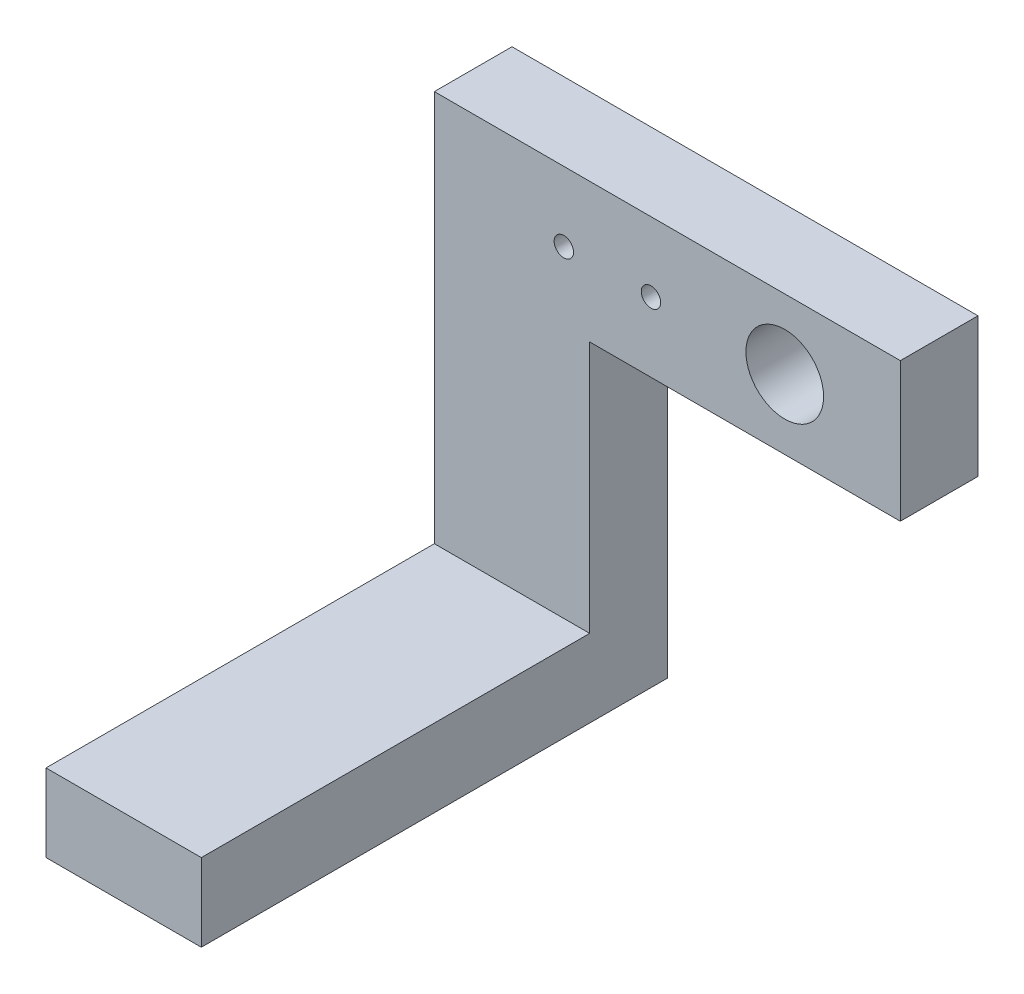
ISO-10303-21;
HEADER;
FILE_DESCRIPTION(('STEP AP214'),'2;1');
FILE_NAME('part.step','',(''),(''),'','','');
FILE_SCHEMA(('AUTOMOTIVE_DESIGN { 1 0 10303 214 1 1 1 1 }'));
ENDSEC;
DATA;
#1=APPLICATION_CONTEXT('core data for automotive mechanical design processes');
#2=APPLICATION_PROTOCOL_DEFINITION('international standard','automotive_design',2000,#1);
#3=PRODUCT_CONTEXT('',#1,'mechanical');
#4=PRODUCT('Part','Part','',(#3));
#5=PRODUCT_RELATED_PRODUCT_CATEGORY('part','',(#4));
#6=PRODUCT_DEFINITION_FORMATION('','',#4);
#7=PRODUCT_DEFINITION_CONTEXT('part definition',#1,'design');
#8=PRODUCT_DEFINITION('design','',#6,#7);
#9=PRODUCT_DEFINITION_SHAPE('','',#8);
#10=(LENGTH_UNIT() NAMED_UNIT(*) SI_UNIT(.MILLI.,.METRE.));
#11=(NAMED_UNIT(*) PLANE_ANGLE_UNIT() SI_UNIT($,.RADIAN.));
#12=(NAMED_UNIT(*) SI_UNIT($,.STERADIAN.) SOLID_ANGLE_UNIT());
#13=UNCERTAINTY_MEASURE_WITH_UNIT(LENGTH_MEASURE(1.E-05),#10,'distance_accuracy_value','');
#14=(GEOMETRIC_REPRESENTATION_CONTEXT(3) GLOBAL_UNCERTAINTY_ASSIGNED_CONTEXT((#13)) GLOBAL_UNIT_ASSIGNED_CONTEXT((#10,
#11,#12)) REPRESENTATION_CONTEXT('',''));
#15=CARTESIAN_POINT('',(0.,0.,0.));
#16=DIRECTION('',(0.,0.,1.));
#17=DIRECTION('',(1.,0.,0.));
#18=AXIS2_PLACEMENT_3D('',#15,#16,#17);
#19=CARTESIAN_POINT('',(7.56000000000001,-4.55,5.08));
#20=DIRECTION('',(-1.,0.,0.));
#21=DIRECTION('',(0.,-1.,0.));
#22=AXIS2_PLACEMENT_3D('',#19,#20,#21);
#23=PLANE('',#22);
#24=DIRECTION('',(0.,1.,0.));
#25=VECTOR('',#24,1.);
#26=CARTESIAN_POINT('',(7.56000000000001,-4.55,0.));
#27=LINE('',#26,#25);
#28=CARTESIAN_POINT('',(7.56000000000001,-4.55,0.));
#29=VERTEX_POINT('',#28);
#30=CARTESIAN_POINT('',(7.56000000000001,4.55,0.));
#31=VERTEX_POINT('',#30);
#32=EDGE_CURVE('E151',#29,#31,#27,.T.);
#33=ORIENTED_EDGE('',*,*,#32,.T.);
#34=DIRECTION('',(0.,0.,-1.));
#35=VECTOR('',#34,1.);
#36=CARTESIAN_POINT('',(7.56000000000001,4.55,5.08));
#37=LINE('',#36,#35);
#38=CARTESIAN_POINT('',(7.56000000000001,4.55,5.08));
#39=VERTEX_POINT('',#38);
#40=EDGE_CURVE('E11',#39,#31,#37,.T.);
#41=ORIENTED_EDGE('',*,*,#40,.F.);
#42=DIRECTION('',(0.,1.,0.));
#43=VECTOR('',#42,1.);
#44=CARTESIAN_POINT('',(7.56000000000001,-4.55,5.08));
#45=LINE('',#44,#43);
#46=CARTESIAN_POINT('',(7.56000000000001,-4.55,5.08));
#47=VERTEX_POINT('',#46);
#48=EDGE_CURVE('E152',#47,#39,#45,.T.);
#49=ORIENTED_EDGE('',*,*,#48,.F.);
#50=DIRECTION('',(0.,0.,-1.));
#51=VECTOR('',#50,1.);
#52=CARTESIAN_POINT('',(7.56000000000001,-4.55,5.08));
#53=LINE('',#52,#51);
#54=EDGE_CURVE('E160',#47,#29,#53,.T.);
#55=ORIENTED_EDGE('',*,*,#54,.T.);
#56=EDGE_LOOP('',(#33,#41,#49,#55));
#57=FACE_BOUND('',#56,.T.);
#58=ADVANCED_FACE('F40',(#57),#23,.F.);
#59=CARTESIAN_POINT('',(7.56000000000001,4.55,5.08));
#60=DIRECTION('',(0.,-1.,0.));
#61=DIRECTION('',(1.,0.,0.));
#62=AXIS2_PLACEMENT_3D('',#59,#60,#61);
#63=PLANE('',#62);
#64=DIRECTION('',(-1.,0.,0.));
#65=VECTOR('',#64,1.);
#66=CARTESIAN_POINT('',(7.56000000000001,4.55,0.));
#67=LINE('',#66,#65);
#68=CARTESIAN_POINT('',(-22.92,4.55,0.));
#69=VERTEX_POINT('',#68);
#70=EDGE_CURVE('E163',#31,#69,#67,.T.);
#71=ORIENTED_EDGE('',*,*,#70,.T.);
#72=DIRECTION('',(0.,0.,-1.));
#73=VECTOR('',#72,1.);
#74=CARTESIAN_POINT('',(-22.92,4.55,5.08));
#75=LINE('',#74,#73);
#76=CARTESIAN_POINT('',(-22.92,4.55,5.08));
#77=VERTEX_POINT('',#76);
#78=EDGE_CURVE('E47',#77,#69,#75,.T.);
#79=ORIENTED_EDGE('',*,*,#78,.F.);
#80=DIRECTION('',(-1.,0.,0.));
#81=VECTOR('',#80,1.);
#82=CARTESIAN_POINT('',(7.56000000000001,4.55,5.08));
#83=LINE('',#82,#81);
#84=EDGE_CURVE('E95',#39,#77,#83,.T.);
#85=ORIENTED_EDGE('',*,*,#84,.F.);
#86=ORIENTED_EDGE('',*,*,#40,.T.);
#87=EDGE_LOOP('',(#71,#79,#85,#86));
#88=FACE_BOUND('',#87,.T.);
#89=ADVANCED_FACE('F175',(#88),#63,.F.);
#90=CARTESIAN_POINT('',(-22.92,-4.55,5.08));
#91=DIRECTION('',(1.,0.,0.));
#92=DIRECTION('',(0.,1.,0.));
#93=AXIS2_PLACEMENT_3D('',#90,#91,#92);
#94=PLANE('',#93);
#95=DIRECTION('',(0.,-1.,0.));
#96=VECTOR('',#95,1.);
#97=CARTESIAN_POINT('',(-22.92,-4.55,0.));
#98=LINE('',#97,#96);
#99=CARTESIAN_POINT('',(-22.92,-26.14,0.));
#100=VERTEX_POINT('',#99);
#101=EDGE_CURVE('E120',#69,#100,#98,.T.);
#102=ORIENTED_EDGE('',*,*,#101,.T.);
#103=DIRECTION('',(0.,0.,-1.));
#104=VECTOR('',#103,1.);
#105=CARTESIAN_POINT('',(-22.92,-26.14,5.08));
#106=LINE('',#105,#104);
#107=CARTESIAN_POINT('',(-22.92,-26.14,30.48));
#108=VERTEX_POINT('',#107);
#109=EDGE_CURVE('E113',#108,#100,#106,.T.);
#110=ORIENTED_EDGE('',*,*,#109,.F.);
#111=DIRECTION('',(0.,-1.,0.));
#112=VECTOR('',#111,1.);
#113=CARTESIAN_POINT('',(-22.92,-26.14,30.48));
#114=LINE('',#113,#112);
#115=CARTESIAN_POINT('',(-22.92,-21.06,30.48));
#116=VERTEX_POINT('',#115);
#117=EDGE_CURVE('E118',#116,#108,#114,.T.);
#118=ORIENTED_EDGE('',*,*,#117,.F.);
#119=DIRECTION('',(0.,0.,-1.));
#120=VECTOR('',#119,1.);
#121=CARTESIAN_POINT('',(-22.92,-21.06,30.48));
#122=LINE('',#121,#120);
#123=CARTESIAN_POINT('',(-22.92,-21.06,5.08));
#124=VERTEX_POINT('',#123);
#125=EDGE_CURVE('E145',#116,#124,#122,.T.);
#126=ORIENTED_EDGE('',*,*,#125,.T.);
#127=DIRECTION('',(0.,1.,0.));
#128=VECTOR('',#127,1.);
#129=CARTESIAN_POINT('',(-22.92,-4.55,5.08));
#130=LINE('',#129,#128);
#131=EDGE_CURVE('E155',#124,#77,#130,.T.);
#132=ORIENTED_EDGE('',*,*,#131,.T.);
#133=ORIENTED_EDGE('',*,*,#78,.T.);
#134=EDGE_LOOP('',(#102,#110,#118,#126,#132,#133));
#135=FACE_BOUND('',#134,.T.);
#136=ADVANCED_FACE('F115',(#135),#94,.F.);
#137=CARTESIAN_POINT('',(-22.92,-26.14,5.08));
#138=DIRECTION('',(0.,1.,0.));
#139=DIRECTION('',(-1.,0.,0.));
#140=AXIS2_PLACEMENT_3D('',#137,#138,#139);
#141=PLANE('',#140);
#142=DIRECTION('',(1.,0.,0.));
#143=VECTOR('',#142,1.);
#144=CARTESIAN_POINT('',(-22.92,-26.14,0.));
#145=LINE('',#144,#143);
#146=CARTESIAN_POINT('',(-12.76,-26.14,0.));
#147=VERTEX_POINT('',#146);
#148=EDGE_CURVE('E167',#100,#147,#145,.T.);
#149=ORIENTED_EDGE('',*,*,#148,.T.);
#150=DIRECTION('',(0.,0.,-1.));
#151=VECTOR('',#150,1.);
#152=CARTESIAN_POINT('',(-12.76,-26.14,5.08));
#153=LINE('',#152,#151);
#154=CARTESIAN_POINT('',(-12.76,-26.14,30.48));
#155=VERTEX_POINT('',#154);
#156=EDGE_CURVE('E123',#155,#147,#153,.T.);
#157=ORIENTED_EDGE('',*,*,#156,.F.);
#158=DIRECTION('',(1.,0.,0.));
#159=VECTOR('',#158,1.);
#160=CARTESIAN_POINT('',(-22.92,-26.14,30.48));
#161=LINE('',#160,#159);
#162=EDGE_CURVE('E126',#108,#155,#161,.T.);
#163=ORIENTED_EDGE('',*,*,#162,.F.);
#164=ORIENTED_EDGE('',*,*,#109,.T.);
#165=EDGE_LOOP('',(#149,#157,#163,#164));
#166=FACE_BOUND('',#165,.T.);
#167=ADVANCED_FACE('F127',(#166),#141,.F.);
#168=CARTESIAN_POINT('',(-12.76,-26.14,5.08));
#169=DIRECTION('',(-1.,0.,0.));
#170=DIRECTION('',(0.,0.,1.));
#171=AXIS2_PLACEMENT_3D('',#168,#169,#170);
#172=PLANE('',#171);
#173=DIRECTION('',(0.,1.,0.));
#174=VECTOR('',#173,1.);
#175=CARTESIAN_POINT('',(-12.76,-26.14,0.));
#176=LINE('',#175,#174);
#177=CARTESIAN_POINT('',(-12.76,-4.55,0.));
#178=VERTEX_POINT('',#177);
#179=EDGE_CURVE('E169',#147,#178,#176,.T.);
#180=ORIENTED_EDGE('',*,*,#179,.T.);
#181=DIRECTION('',(0.,0.,-1.));
#182=VECTOR('',#181,1.);
#183=CARTESIAN_POINT('',(-12.76,-4.55,5.08));
#184=LINE('',#183,#182);
#185=CARTESIAN_POINT('',(-12.76,-4.55,5.08));
#186=VERTEX_POINT('',#185);
#187=EDGE_CURVE('E173',#186,#178,#184,.T.);
#188=ORIENTED_EDGE('',*,*,#187,.F.);
#189=DIRECTION('',(0.,1.,0.));
#190=VECTOR('',#189,1.);
#191=CARTESIAN_POINT('',(-12.76,-26.14,5.08));
#192=LINE('',#191,#190);
#193=CARTESIAN_POINT('',(-12.76,-21.06,5.08));
#194=VERTEX_POINT('',#193);
#195=EDGE_CURVE('E157',#194,#186,#192,.T.);
#196=ORIENTED_EDGE('',*,*,#195,.F.);
#197=DIRECTION('',(0.,0.,-1.));
#198=VECTOR('',#197,1.);
#199=CARTESIAN_POINT('',(-12.76,-21.06,30.48));
#200=LINE('',#199,#198);
#201=CARTESIAN_POINT('',(-12.76,-21.06,30.48));
#202=VERTEX_POINT('',#201);
#203=EDGE_CURVE('E148',#202,#194,#200,.T.);
#204=ORIENTED_EDGE('',*,*,#203,.F.);
#205=DIRECTION('',(0.,1.,0.));
#206=VECTOR('',#205,1.);
#207=CARTESIAN_POINT('',(-12.76,-26.14,30.48));
#208=LINE('',#207,#206);
#209=EDGE_CURVE('E131',#155,#202,#208,.T.);
#210=ORIENTED_EDGE('',*,*,#209,.F.);
#211=ORIENTED_EDGE('',*,*,#156,.T.);
#212=EDGE_LOOP('',(#180,#188,#196,#204,#210,#211));
#213=FACE_BOUND('',#212,.T.);
#214=ADVANCED_FACE('F182',(#213),#172,.F.);
#215=CARTESIAN_POINT('',(-12.76,-4.55,5.08));
#216=DIRECTION('',(0.,1.,0.));
#217=DIRECTION('',(0.,0.,1.));
#218=AXIS2_PLACEMENT_3D('',#215,#216,#217);
#219=PLANE('',#218);
#220=DIRECTION('',(1.,0.,0.));
#221=VECTOR('',#220,1.);
#222=CARTESIAN_POINT('',(-12.76,-4.55,0.));
#223=LINE('',#222,#221);
#224=EDGE_CURVE('E88',#178,#29,#223,.T.);
#225=ORIENTED_EDGE('',*,*,#224,.T.);
#226=ORIENTED_EDGE('',*,*,#54,.F.);
#227=DIRECTION('',(1.,0.,0.));
#228=VECTOR('',#227,1.);
#229=CARTESIAN_POINT('',(-12.76,-4.55,5.08));
#230=LINE('',#229,#228);
#231=EDGE_CURVE('E61',#186,#47,#230,.T.);
#232=ORIENTED_EDGE('',*,*,#231,.F.);
#233=ORIENTED_EDGE('',*,*,#187,.T.);
#234=EDGE_LOOP('',(#225,#226,#232,#233));
#235=FACE_BOUND('',#234,.T.);
#236=ADVANCED_FACE('F205',(#235),#219,.F.);
#237=CARTESIAN_POINT('',(0.,0.,5.08));
#238=DIRECTION('',(0.,0.,1.));
#239=DIRECTION('',(1.,0.,0.));
#240=AXIS2_PLACEMENT_3D('',#237,#238,#239);
#241=PLANE('',#240);
#242=CARTESIAN_POINT('',(-14.45,0.,5.08));
#243=DIRECTION('',(0.,0.,1.));
#244=DIRECTION('',(1.,0.,0.));
#245=AXIS2_PLACEMENT_3D('',#242,#243,#244);
#246=CIRCLE('',#245,0.635000000000001);
#247=CARTESIAN_POINT('',(-13.815,0.,5.08));
#248=VERTEX_POINT('',#247);
#249=EDGE_CURVE('E138',#248,#248,#246,.F.);
#250=ORIENTED_EDGE('',*,*,#249,.T.);
#251=EDGE_LOOP('',(#250));
#252=FACE_BOUND('',#251,.T.);
#253=CARTESIAN_POINT('',(-8.74999999999998,0.,5.08));
#254=DIRECTION('',(0.,0.,1.));
#255=DIRECTION('',(1.,0.,0.));
#256=AXIS2_PLACEMENT_3D('',#253,#254,#255);
#257=CIRCLE('',#256,0.635000000000001);
#258=CARTESIAN_POINT('',(-8.11499999999998,0.,5.08));
#259=VERTEX_POINT('',#258);
#260=EDGE_CURVE('E375',#259,#259,#257,.F.);
#261=ORIENTED_EDGE('',*,*,#260,.T.);
#262=EDGE_LOOP('',(#261));
#263=FACE_BOUND('',#262,.T.);
#264=CARTESIAN_POINT('',(0.,0.,5.08));
#265=DIRECTION('',(0.,0.,1.));
#266=DIRECTION('',(1.,0.,0.));
#267=AXIS2_PLACEMENT_3D('',#264,#265,#266);
#268=CIRCLE('',#267,2.54);
#269=CARTESIAN_POINT('',(2.54,0.,5.08));
#270=VERTEX_POINT('',#269);
#271=EDGE_CURVE('E379',#270,#270,#268,.F.);
#272=ORIENTED_EDGE('',*,*,#271,.T.);
#273=EDGE_LOOP('',(#272));
#274=FACE_BOUND('',#273,.T.);
#275=DIRECTION('',(-1.,0.,0.));
#276=VECTOR('',#275,1.);
#277=CARTESIAN_POINT('',(-22.92,-21.06,5.08));
#278=LINE('',#277,#276);
#279=EDGE_CURVE('E54',#194,#124,#278,.T.);
#280=ORIENTED_EDGE('',*,*,#279,.F.);
#281=ORIENTED_EDGE('',*,*,#195,.T.);
#282=ORIENTED_EDGE('',*,*,#231,.T.);
#283=ORIENTED_EDGE('',*,*,#48,.T.);
#284=ORIENTED_EDGE('',*,*,#84,.T.);
#285=ORIENTED_EDGE('',*,*,#131,.F.);
#286=EDGE_LOOP('',(#280,#281,#282,#283,#284,#285));
#287=FACE_BOUND('',#286,.T.);
#288=ADVANCED_FACE('F195',(#252,#263,#274,#287),#241,.T.);
#289=CARTESIAN_POINT('',(0.,0.,0.));
#290=DIRECTION('',(0.,0.,1.));
#291=DIRECTION('',(1.,0.,0.));
#292=AXIS2_PLACEMENT_3D('',#289,#290,#291);
#293=PLANE('',#292);
#294=CARTESIAN_POINT('',(-14.45,0.,0.));
#295=DIRECTION('',(0.,0.,-1.));
#296=DIRECTION('',(-1.,0.,0.));
#297=AXIS2_PLACEMENT_3D('',#294,#295,#296);
#298=CIRCLE('',#297,0.635000000000001);
#299=CARTESIAN_POINT('',(-15.085,0.,0.));
#300=VERTEX_POINT('',#299);
#301=EDGE_CURVE('E368',#300,#300,#298,.T.);
#302=ORIENTED_EDGE('',*,*,#301,.F.);
#303=EDGE_LOOP('',(#302));
#304=FACE_BOUND('',#303,.T.);
#305=CARTESIAN_POINT('',(-8.74999999999998,0.,0.));
#306=DIRECTION('',(0.,0.,-1.));
#307=DIRECTION('',(-1.,0.,0.));
#308=AXIS2_PLACEMENT_3D('',#305,#306,#307);
#309=CIRCLE('',#308,0.635000000000001);
#310=CARTESIAN_POINT('',(-9.38499999999998,0.,0.));
#311=VERTEX_POINT('',#310);
#312=EDGE_CURVE('E372',#311,#311,#309,.T.);
#313=ORIENTED_EDGE('',*,*,#312,.F.);
#314=EDGE_LOOP('',(#313));
#315=FACE_BOUND('',#314,.T.);
#316=CARTESIAN_POINT('',(0.,0.,0.));
#317=DIRECTION('',(0.,0.,-1.));
#318=DIRECTION('',(-1.,0.,0.));
#319=AXIS2_PLACEMENT_3D('',#316,#317,#318);
#320=CIRCLE('',#319,2.54);
#321=CARTESIAN_POINT('',(-2.54,0.,0.));
#322=VERTEX_POINT('',#321);
#323=EDGE_CURVE('E141',#322,#322,#320,.T.);
#324=ORIENTED_EDGE('',*,*,#323,.F.);
#325=EDGE_LOOP('',(#324));
#326=FACE_BOUND('',#325,.T.);
#327=ORIENTED_EDGE('',*,*,#32,.F.);
#328=ORIENTED_EDGE('',*,*,#224,.F.);
#329=ORIENTED_EDGE('',*,*,#179,.F.);
#330=ORIENTED_EDGE('',*,*,#148,.F.);
#331=ORIENTED_EDGE('',*,*,#101,.F.);
#332=ORIENTED_EDGE('',*,*,#70,.F.);
#333=EDGE_LOOP('',(#327,#328,#329,#330,#331,#332));
#334=FACE_BOUND('',#333,.T.);
#335=ADVANCED_FACE('F179',(#304,#315,#326,#334),#293,.F.);
#336=CARTESIAN_POINT('',(-22.92,-21.06,30.48));
#337=DIRECTION('',(0.,-1.,0.));
#338=DIRECTION('',(0.,0.,-1.));
#339=AXIS2_PLACEMENT_3D('',#336,#337,#338);
#340=PLANE('',#339);
#341=ORIENTED_EDGE('',*,*,#279,.T.);
#342=ORIENTED_EDGE('',*,*,#125,.F.);
#343=DIRECTION('',(-1.,0.,0.));
#344=VECTOR('',#343,1.);
#345=CARTESIAN_POINT('',(-22.92,-21.06,30.48));
#346=LINE('',#345,#344);
#347=EDGE_CURVE('E135',#202,#116,#346,.T.);
#348=ORIENTED_EDGE('',*,*,#347,.F.);
#349=ORIENTED_EDGE('',*,*,#203,.T.);
#350=EDGE_LOOP('',(#341,#342,#348,#349));
#351=FACE_BOUND('',#350,.T.);
#352=ADVANCED_FACE('F186',(#351),#340,.F.);
#353=CARTESIAN_POINT('',(0.,0.,30.48));
#354=DIRECTION('',(0.,0.,-1.));
#355=DIRECTION('',(-1.,0.,0.));
#356=AXIS2_PLACEMENT_3D('',#353,#354,#355);
#357=PLANE('',#356);
#358=ORIENTED_EDGE('',*,*,#117,.T.);
#359=ORIENTED_EDGE('',*,*,#162,.T.);
#360=ORIENTED_EDGE('',*,*,#209,.T.);
#361=ORIENTED_EDGE('',*,*,#347,.T.);
#362=EDGE_LOOP('',(#358,#359,#360,#361));
#363=FACE_BOUND('',#362,.T.);
#364=ADVANCED_FACE('F133',(#363),#357,.F.);
#365=CARTESIAN_POINT('',(0.,0.,12.2642048968553));
#366=DIRECTION('',(0.,0.,-1.));
#367=DIRECTION('',(-1.,0.,0.));
#368=AXIS2_PLACEMENT_3D('',#365,#366,#367);
#369=CYLINDRICAL_SURFACE('',#368,2.54);
#370=ORIENTED_EDGE('',*,*,#323,.T.);
#371=EDGE_LOOP('',(#370));
#372=FACE_BOUND('',#371,.T.);
#373=ORIENTED_EDGE('',*,*,#271,.F.);
#374=EDGE_LOOP('',(#373));
#375=FACE_BOUND('',#374,.T.);
#376=ADVANCED_FACE('F193',(#372,#375),#369,.F.);
#377=CARTESIAN_POINT('',(-8.74999999999998,0.,12.2642048968553));
#378=DIRECTION('',(0.,0.,-1.));
#379=DIRECTION('',(-1.,0.,0.));
#380=AXIS2_PLACEMENT_3D('',#377,#378,#379);
#381=CYLINDRICAL_SURFACE('',#380,0.635000000000001);
#382=ORIENTED_EDGE('',*,*,#312,.T.);
#383=EDGE_LOOP('',(#382));
#384=FACE_BOUND('',#383,.T.);
#385=ORIENTED_EDGE('',*,*,#260,.F.);
#386=EDGE_LOOP('',(#385));
#387=FACE_BOUND('',#386,.T.);
#388=ADVANCED_FACE('F266',(#384,#387),#381,.F.);
#389=CARTESIAN_POINT('',(-14.45,0.,12.2642048968553));
#390=DIRECTION('',(0.,0.,-1.));
#391=DIRECTION('',(-1.,0.,0.));
#392=AXIS2_PLACEMENT_3D('',#389,#390,#391);
#393=CYLINDRICAL_SURFACE('',#392,0.635000000000001);
#394=ORIENTED_EDGE('',*,*,#301,.T.);
#395=EDGE_LOOP('',(#394));
#396=FACE_BOUND('',#395,.T.);
#397=ORIENTED_EDGE('',*,*,#249,.F.);
#398=EDGE_LOOP('',(#397));
#399=FACE_BOUND('',#398,.T.);
#400=ADVANCED_FACE('F276',(#396,#399),#393,.F.);
#401=CLOSED_SHELL('',(#58,#89,#136,#167,#214,#236,#288,#335,#352,#364,#376,#388,#400));
#402=MANIFOLD_SOLID_BREP('B2',#401);
#403=ADVANCED_BREP_SHAPE_REPRESENTATION('',(#18,#402),#14);
#404=SHAPE_DEFINITION_REPRESENTATION(#9,#403);
ENDSEC;
END-ISO-10303-21;
